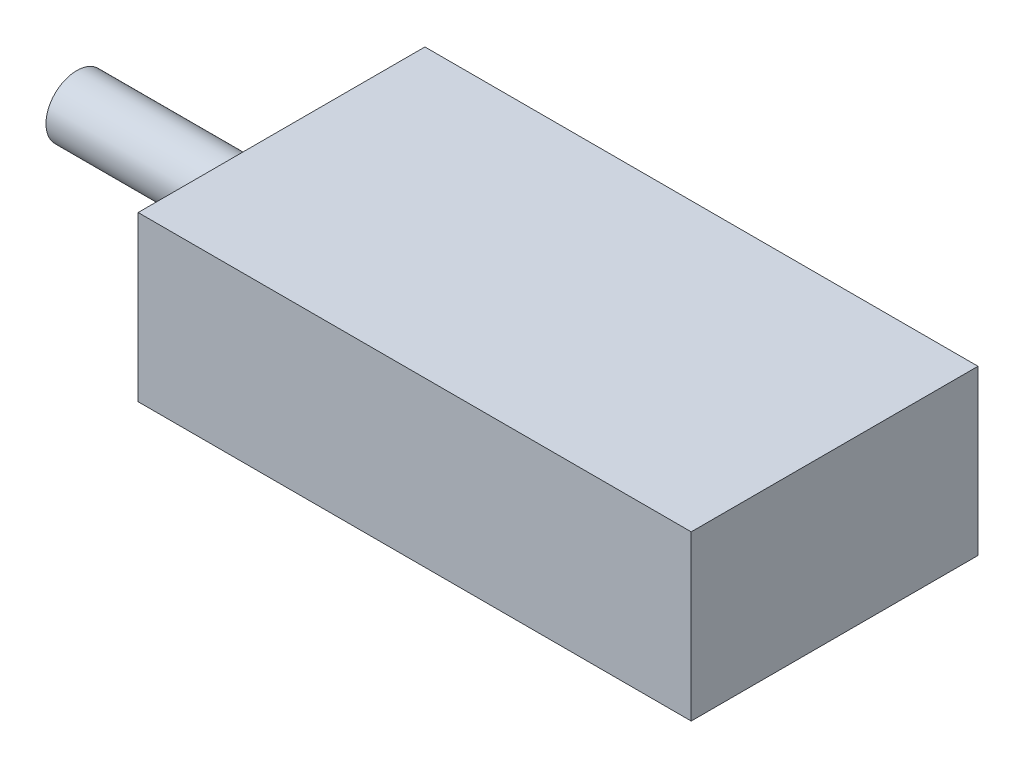
ISO-10303-21;
HEADER;
FILE_DESCRIPTION(('STEP AP214'),'2;1');
FILE_NAME('part.step','',(''),(''),'','','');
FILE_SCHEMA(('AUTOMOTIVE_DESIGN { 1 0 10303 214 1 1 1 1 }'));
ENDSEC;
DATA;
#1=APPLICATION_CONTEXT('core data for automotive mechanical design processes');
#2=APPLICATION_PROTOCOL_DEFINITION('international standard','automotive_design',2000,#1);
#3=PRODUCT_CONTEXT('',#1,'mechanical');
#4=PRODUCT('Part','Part','',(#3));
#5=PRODUCT_RELATED_PRODUCT_CATEGORY('part','',(#4));
#6=PRODUCT_DEFINITION_FORMATION('','',#4);
#7=PRODUCT_DEFINITION_CONTEXT('part definition',#1,'design');
#8=PRODUCT_DEFINITION('design','',#6,#7);
#9=PRODUCT_DEFINITION_SHAPE('','',#8);
#10=(LENGTH_UNIT() NAMED_UNIT(*) SI_UNIT(.MILLI.,.METRE.));
#11=(NAMED_UNIT(*) PLANE_ANGLE_UNIT() SI_UNIT($,.RADIAN.));
#12=(NAMED_UNIT(*) SI_UNIT($,.STERADIAN.) SOLID_ANGLE_UNIT());
#13=UNCERTAINTY_MEASURE_WITH_UNIT(LENGTH_MEASURE(1.E-05),#10,'distance_accuracy_value','');
#14=(GEOMETRIC_REPRESENTATION_CONTEXT(3) GLOBAL_UNCERTAINTY_ASSIGNED_CONTEXT((#13)) GLOBAL_UNIT_ASSIGNED_CONTEXT((#10,
#11,#12)) REPRESENTATION_CONTEXT('',''));
#15=CARTESIAN_POINT('',(0.,0.,0.));
#16=DIRECTION('',(0.,0.,1.));
#17=DIRECTION('',(1.,0.,0.));
#18=AXIS2_PLACEMENT_3D('',#15,#16,#17);
#19=CARTESIAN_POINT('',(13.5,8.,7.));
#20=DIRECTION('',(-1.,0.,0.));
#21=DIRECTION('',(0.,0.,1.));
#22=AXIS2_PLACEMENT_3D('',#19,#20,#21);
#23=PLANE('',#22);
#24=DIRECTION('',(0.,0.,-1.));
#25=VECTOR('',#24,1.);
#26=CARTESIAN_POINT('',(13.5,0.,7.));
#27=LINE('',#26,#25);
#28=CARTESIAN_POINT('',(13.5,0.,7.));
#29=VERTEX_POINT('',#28);
#30=CARTESIAN_POINT('',(13.5,0.,-7.));
#31=VERTEX_POINT('',#30);
#32=EDGE_CURVE('E109',#29,#31,#27,.T.);
#33=ORIENTED_EDGE('',*,*,#32,.T.);
#34=DIRECTION('',(0.,-1.,0.));
#35=VECTOR('',#34,1.);
#36=CARTESIAN_POINT('',(13.5,8.,-7.));
#37=LINE('',#36,#35);
#38=CARTESIAN_POINT('',(13.5,8.,-7.));
#39=VERTEX_POINT('',#38);
#40=EDGE_CURVE('E11',#39,#31,#37,.T.);
#41=ORIENTED_EDGE('',*,*,#40,.F.);
#42=DIRECTION('',(0.,0.,-1.));
#43=VECTOR('',#42,1.);
#44=CARTESIAN_POINT('',(13.5,8.,7.));
#45=LINE('',#44,#43);
#46=CARTESIAN_POINT('',(13.5,8.,7.));
#47=VERTEX_POINT('',#46);
#48=EDGE_CURVE('E98',#47,#39,#45,.T.);
#49=ORIENTED_EDGE('',*,*,#48,.F.);
#50=DIRECTION('',(0.,-1.,0.));
#51=VECTOR('',#50,1.);
#52=CARTESIAN_POINT('',(13.5,8.,7.));
#53=LINE('',#52,#51);
#54=EDGE_CURVE('E106',#47,#29,#53,.T.);
#55=ORIENTED_EDGE('',*,*,#54,.T.);
#56=EDGE_LOOP('',(#33,#41,#49,#55));
#57=FACE_BOUND('',#56,.T.);
#58=ADVANCED_FACE('F50',(#57),#23,.F.);
#59=CARTESIAN_POINT('',(-13.5,8.,-7.));
#60=DIRECTION('',(0.,0.,1.));
#61=DIRECTION('',(1.,0.,0.));
#62=AXIS2_PLACEMENT_3D('',#59,#60,#61);
#63=PLANE('',#62);
#64=DIRECTION('',(-1.,0.,0.));
#65=VECTOR('',#64,1.);
#66=CARTESIAN_POINT('',(-13.5,0.,-7.));
#67=LINE('',#66,#65);
#68=CARTESIAN_POINT('',(-13.5,0.,-7.));
#69=VERTEX_POINT('',#68);
#70=EDGE_CURVE('E105',#31,#69,#67,.T.);
#71=ORIENTED_EDGE('',*,*,#70,.T.);
#72=DIRECTION('',(0.,-1.,0.));
#73=VECTOR('',#72,1.);
#74=CARTESIAN_POINT('',(-13.5,8.,-7.));
#75=LINE('',#74,#73);
#76=CARTESIAN_POINT('',(-13.5,8.,-7.));
#77=VERTEX_POINT('',#76);
#78=EDGE_CURVE('E54',#77,#69,#75,.T.);
#79=ORIENTED_EDGE('',*,*,#78,.F.);
#80=DIRECTION('',(-1.,0.,0.));
#81=VECTOR('',#80,1.);
#82=CARTESIAN_POINT('',(-13.5,8.,-7.));
#83=LINE('',#82,#81);
#84=EDGE_CURVE('E91',#39,#77,#83,.T.);
#85=ORIENTED_EDGE('',*,*,#84,.F.);
#86=ORIENTED_EDGE('',*,*,#40,.T.);
#87=EDGE_LOOP('',(#71,#79,#85,#86));
#88=FACE_BOUND('',#87,.T.);
#89=ADVANCED_FACE('F101',(#88),#63,.F.);
#90=CARTESIAN_POINT('',(-13.5,8.,7.));
#91=DIRECTION('',(1.,0.,0.));
#92=DIRECTION('',(0.,0.,-1.));
#93=AXIS2_PLACEMENT_3D('',#90,#91,#92);
#94=PLANE('',#93);
#95=CARTESIAN_POINT('',(-13.5,4.,0.));
#96=DIRECTION('',(1.,0.,0.));
#97=DIRECTION('',(0.,0.,-1.));
#98=AXIS2_PLACEMENT_3D('',#95,#96,#97);
#99=CIRCLE('',#98,1.5);
#100=CARTESIAN_POINT('',(-13.5,4.,-1.5));
#101=VERTEX_POINT('',#100);
#102=EDGE_CURVE('E114',#101,#101,#99,.T.);
#103=ORIENTED_EDGE('',*,*,#102,.T.);
#104=EDGE_LOOP('',(#103));
#105=FACE_BOUND('',#104,.T.);
#106=DIRECTION('',(0.,0.,1.));
#107=VECTOR('',#106,1.);
#108=CARTESIAN_POINT('',(-13.5,0.,7.));
#109=LINE('',#108,#107);
#110=CARTESIAN_POINT('',(-13.5,0.,7.));
#111=VERTEX_POINT('',#110);
#112=EDGE_CURVE('E80',#69,#111,#109,.T.);
#113=ORIENTED_EDGE('',*,*,#112,.T.);
#114=DIRECTION('',(0.,-1.,0.));
#115=VECTOR('',#114,1.);
#116=CARTESIAN_POINT('',(-13.5,8.,7.));
#117=LINE('',#116,#115);
#118=CARTESIAN_POINT('',(-13.5,8.,7.));
#119=VERTEX_POINT('',#118);
#120=EDGE_CURVE('E103',#119,#111,#117,.T.);
#121=ORIENTED_EDGE('',*,*,#120,.F.);
#122=DIRECTION('',(0.,0.,1.));
#123=VECTOR('',#122,1.);
#124=CARTESIAN_POINT('',(-13.5,8.,7.));
#125=LINE('',#124,#123);
#126=EDGE_CURVE('E96',#77,#119,#125,.T.);
#127=ORIENTED_EDGE('',*,*,#126,.F.);
#128=ORIENTED_EDGE('',*,*,#78,.T.);
#129=EDGE_LOOP('',(#113,#121,#127,#128));
#130=FACE_BOUND('',#129,.T.);
#131=ADVANCED_FACE('F102',(#105,#130),#94,.F.);
#132=CARTESIAN_POINT('',(-13.5,8.,7.));
#133=DIRECTION('',(0.,0.,-1.));
#134=DIRECTION('',(-1.,0.,0.));
#135=AXIS2_PLACEMENT_3D('',#132,#133,#134);
#136=PLANE('',#135);
#137=DIRECTION('',(1.,0.,0.));
#138=VECTOR('',#137,1.);
#139=CARTESIAN_POINT('',(-13.5,0.,7.));
#140=LINE('',#139,#138);
#141=EDGE_CURVE('E88',#111,#29,#140,.T.);
#142=ORIENTED_EDGE('',*,*,#141,.T.);
#143=ORIENTED_EDGE('',*,*,#54,.F.);
#144=DIRECTION('',(1.,0.,0.));
#145=VECTOR('',#144,1.);
#146=CARTESIAN_POINT('',(-13.5,8.,7.));
#147=LINE('',#146,#145);
#148=EDGE_CURVE('E64',#119,#47,#147,.T.);
#149=ORIENTED_EDGE('',*,*,#148,.F.);
#150=ORIENTED_EDGE('',*,*,#120,.T.);
#151=EDGE_LOOP('',(#142,#143,#149,#150));
#152=FACE_BOUND('',#151,.T.);
#153=ADVANCED_FACE('F119',(#152),#136,.F.);
#154=CARTESIAN_POINT('',(0.,8.,0.));
#155=DIRECTION('',(0.,-1.,0.));
#156=DIRECTION('',(0.,0.,-1.));
#157=AXIS2_PLACEMENT_3D('',#154,#155,#156);
#158=PLANE('',#157);
#159=ORIENTED_EDGE('',*,*,#48,.T.);
#160=ORIENTED_EDGE('',*,*,#84,.T.);
#161=ORIENTED_EDGE('',*,*,#126,.T.);
#162=ORIENTED_EDGE('',*,*,#148,.T.);
#163=EDGE_LOOP('',(#159,#160,#161,#162));
#164=FACE_BOUND('',#163,.T.);
#165=ADVANCED_FACE('F94',(#164),#158,.F.);
#166=CARTESIAN_POINT('',(0.,0.,0.));
#167=DIRECTION('',(0.,-1.,0.));
#168=DIRECTION('',(0.,0.,-1.));
#169=AXIS2_PLACEMENT_3D('',#166,#167,#168);
#170=PLANE('',#169);
#171=ORIENTED_EDGE('',*,*,#32,.F.);
#172=ORIENTED_EDGE('',*,*,#141,.F.);
#173=ORIENTED_EDGE('',*,*,#112,.F.);
#174=ORIENTED_EDGE('',*,*,#70,.F.);
#175=EDGE_LOOP('',(#171,#172,#173,#174));
#176=FACE_BOUND('',#175,.T.);
#177=ADVANCED_FACE('F122',(#176),#170,.T.);
#178=CARTESIAN_POINT('',(-13.5,4.,0.));
#179=DIRECTION('',(-1.,0.,0.));
#180=DIRECTION('',(0.,0.,1.));
#181=AXIS2_PLACEMENT_3D('',#178,#179,#180);
#182=CYLINDRICAL_SURFACE('',#181,1.5);
#183=ORIENTED_EDGE('',*,*,#102,.F.);
#184=EDGE_LOOP('',(#183));
#185=FACE_BOUND('',#184,.T.);
#186=CARTESIAN_POINT('',(-23.5,4.,0.));
#187=DIRECTION('',(1.,0.,0.));
#188=DIRECTION('',(0.,0.,-1.));
#189=AXIS2_PLACEMENT_3D('',#186,#187,#188);
#190=CIRCLE('',#189,1.5);
#191=CARTESIAN_POINT('',(-23.5,4.,-1.5));
#192=VERTEX_POINT('',#191);
#193=EDGE_CURVE('E121',#192,#192,#190,.T.);
#194=ORIENTED_EDGE('',*,*,#193,.T.);
#195=EDGE_LOOP('',(#194));
#196=FACE_BOUND('',#195,.T.);
#197=ADVANCED_FACE('F131',(#185,#196),#182,.T.);
#198=CARTESIAN_POINT('',(-23.5,4.,0.));
#199=DIRECTION('',(1.,0.,0.));
#200=DIRECTION('',(0.,0.,-1.));
#201=AXIS2_PLACEMENT_3D('',#198,#199,#200);
#202=PLANE('',#201);
#203=ORIENTED_EDGE('',*,*,#193,.F.);
#204=EDGE_LOOP('',(#203));
#205=FACE_BOUND('',#204,.T.);
#206=ADVANCED_FACE('F133',(#205),#202,.F.);
#207=CLOSED_SHELL('',(#58,#89,#131,#153,#165,#177,#197,#206));
#208=MANIFOLD_SOLID_BREP('B2',#207);
#209=ADVANCED_BREP_SHAPE_REPRESENTATION('',(#18,#208),#14);
#210=SHAPE_DEFINITION_REPRESENTATION(#9,#209);
ENDSEC;
END-ISO-10303-21;
